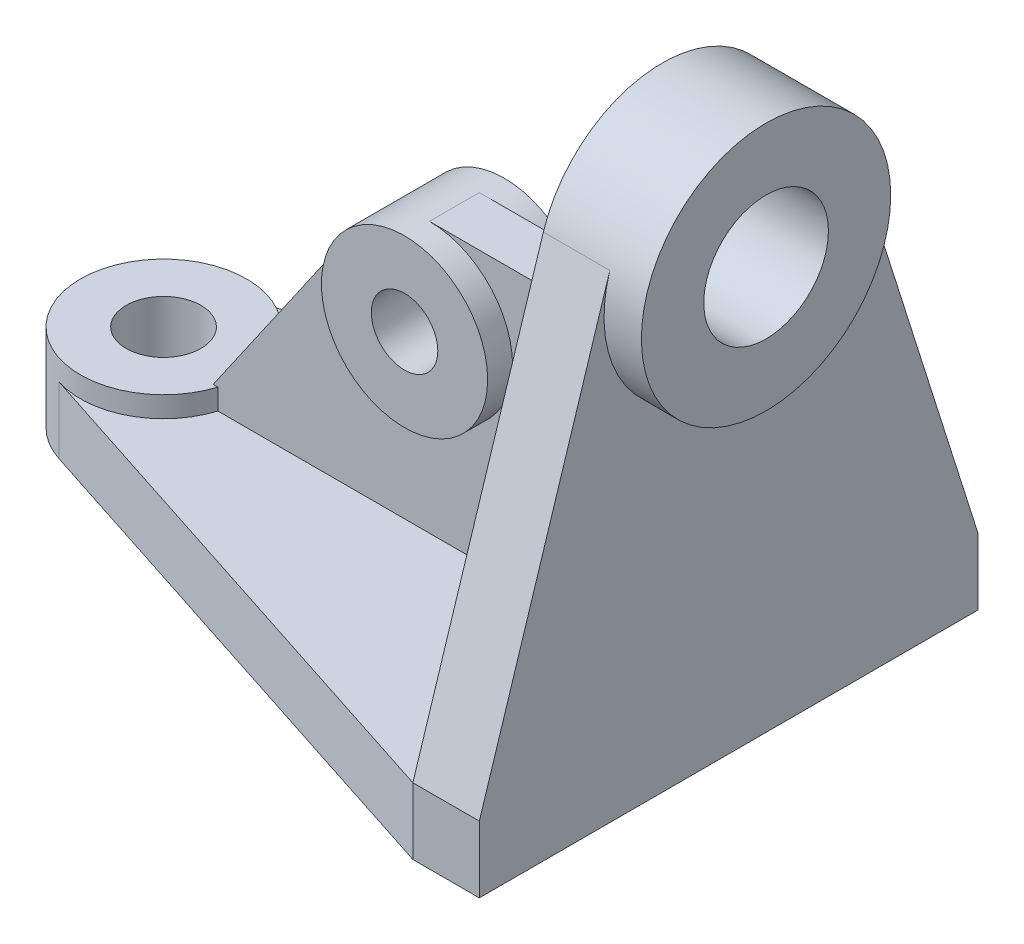
ISO-10303-21;
HEADER;
FILE_DESCRIPTION(('STEP AP214'),'2;1');
FILE_NAME('part.step','',(''),(''),'','','');
FILE_SCHEMA(('AUTOMOTIVE_DESIGN { 1 0 10303 214 1 1 1 1 }'));
ENDSEC;
DATA;
#1=APPLICATION_CONTEXT('core data for automotive mechanical design processes');
#2=APPLICATION_PROTOCOL_DEFINITION('international standard','automotive_design',2000,#1);
#3=PRODUCT_CONTEXT('',#1,'mechanical');
#4=PRODUCT('Part','Part','',(#3));
#5=PRODUCT_RELATED_PRODUCT_CATEGORY('part','',(#4));
#6=PRODUCT_DEFINITION_FORMATION('','',#4);
#7=PRODUCT_DEFINITION_CONTEXT('part definition',#1,'design');
#8=PRODUCT_DEFINITION('design','',#6,#7);
#9=PRODUCT_DEFINITION_SHAPE('','',#8);
#10=(LENGTH_UNIT() NAMED_UNIT(*) SI_UNIT(.MILLI.,.METRE.));
#11=(NAMED_UNIT(*) PLANE_ANGLE_UNIT() SI_UNIT($,.RADIAN.));
#12=(NAMED_UNIT(*) SI_UNIT($,.STERADIAN.) SOLID_ANGLE_UNIT());
#13=UNCERTAINTY_MEASURE_WITH_UNIT(LENGTH_MEASURE(1.E-05),#10,'distance_accuracy_value','');
#14=(GEOMETRIC_REPRESENTATION_CONTEXT(3) GLOBAL_UNCERTAINTY_ASSIGNED_CONTEXT((#13)) GLOBAL_UNIT_ASSIGNED_CONTEXT((#10,
#11,#12)) REPRESENTATION_CONTEXT('',''));
#15=CARTESIAN_POINT('',(0.,0.,0.));
#16=DIRECTION('',(0.,0.,1.));
#17=DIRECTION('',(1.,0.,0.));
#18=AXIS2_PLACEMENT_3D('',#15,#16,#17);
#19=CARTESIAN_POINT('',(0.,16.,0.));
#20=DIRECTION('',(0.,1.,0.));
#21=DIRECTION('',(0.,0.,1.));
#22=AXIS2_PLACEMENT_3D('',#19,#20,#21);
#23=PLANE('',#22);
#24=CARTESIAN_POINT('',(0.,16.,0.));
#25=DIRECTION('',(0.,1.,0.));
#26=DIRECTION('',(0.,0.,1.));
#27=AXIS2_PLACEMENT_3D('',#24,#25,#26);
#28=CIRCLE('',#27,20.);
#29=CARTESIAN_POINT('',(19.0787840283389,16.,-6.));
#30=VERTEX_POINT('',#29);
#31=CARTESIAN_POINT('',(-6.1776661076144,16.,-19.0219988818955));
#32=VERTEX_POINT('',#31);
#33=EDGE_CURVE('E263',#30,#32,#28,.T.);
#34=ORIENTED_EDGE('',*,*,#33,.F.);
#35=DIRECTION('',(-1.,0.,0.));
#36=VECTOR('',#35,1.);
#37=CARTESIAN_POINT('',(0.,16.,-6.));
#38=LINE('',#37,#36);
#39=CARTESIAN_POINT('',(120.,16.,-6.));
#40=VERTEX_POINT('',#39);
#41=EDGE_CURVE('E410',#40,#30,#38,.T.);
#42=ORIENTED_EDGE('',*,*,#41,.F.);
#43=DIRECTION('',(0.,0.,1.));
#44=VECTOR('',#43,1.);
#45=CARTESIAN_POINT('',(120.,16.,0.));
#46=LINE('',#45,#44);
#47=CARTESIAN_POINT('',(120.,16.,-60.));
#48=VERTEX_POINT('',#47);
#49=EDGE_CURVE('E235',#48,#40,#46,.T.);
#50=ORIENTED_EDGE('',*,*,#49,.F.);
#51=DIRECTION('',(-0.951099944094773,0.,0.30888330538072));
#52=VECTOR('',#51,1.);
#53=CARTESIAN_POINT('',(-6.1776661076144,16.,-19.0219988818955));
#54=LINE('',#53,#52);
#55=EDGE_CURVE('E275',#48,#32,#54,.T.);
#56=ORIENTED_EDGE('',*,*,#55,.T.);
#57=EDGE_LOOP('',(#34,#42,#50,#56));
#58=FACE_BOUND('',#57,.T.);
#59=ADVANCED_FACE('F43',(#58),#23,.T.);
#60=DIRECTION('',(-1.,0.,0.));
#61=VECTOR('',#60,1.);
#62=CARTESIAN_POINT('',(0.,16.,6.));
#63=LINE('',#62,#61);
#64=CARTESIAN_POINT('',(120.,16.,6.));
#65=VERTEX_POINT('',#64);
#66=CARTESIAN_POINT('',(19.0787840283389,16.,6.));
#67=VERTEX_POINT('',#66);
#68=EDGE_CURVE('E69',#65,#67,#63,.T.);
#69=ORIENTED_EDGE('',*,*,#68,.T.);
#70=CARTESIAN_POINT('',(-6.1776661076144,16.,19.0219988818955));
#71=VERTEX_POINT('',#70);
#72=EDGE_CURVE('E259',#71,#67,#28,.T.);
#73=ORIENTED_EDGE('',*,*,#72,.F.);
#74=DIRECTION('',(-0.951099944094773,0.,-0.30888330538072));
#75=VECTOR('',#74,1.);
#76=CARTESIAN_POINT('',(-6.1776661076144,16.,19.0219988818954));
#77=LINE('',#76,#75);
#78=CARTESIAN_POINT('',(120.,16.,60.));
#79=VERTEX_POINT('',#78);
#80=EDGE_CURVE('E262',#79,#71,#77,.T.);
#81=ORIENTED_EDGE('',*,*,#80,.F.);
#82=EDGE_CURVE('E233',#65,#79,#46,.T.);
#83=ORIENTED_EDGE('',*,*,#82,.F.);
#84=EDGE_LOOP('',(#69,#73,#81,#83));
#85=FACE_BOUND('',#84,.T.);
#86=ADVANCED_FACE('F338',(#85),#23,.T.);
#87=CARTESIAN_POINT('',(0.,21.,0.));
#88=DIRECTION('',(0.,-1.,0.));
#89=DIRECTION('',(0.,0.,-1.));
#90=AXIS2_PLACEMENT_3D('',#87,#88,#89);
#91=CYLINDRICAL_SURFACE('',#90,20.);
#92=ORIENTED_EDGE('',*,*,#72,.T.);
#93=DIRECTION('',(0.,-1.,0.));
#94=VECTOR('',#93,1.);
#95=CARTESIAN_POINT('',(19.0787840283389,21.,6.));
#96=LINE('',#95,#94);
#97=CARTESIAN_POINT('',(19.0787840283389,21.,6.));
#98=VERTEX_POINT('',#97);
#99=EDGE_CURVE('E210',#67,#98,#96,.F.);
#100=ORIENTED_EDGE('',*,*,#99,.T.);
#101=CARTESIAN_POINT('',(0.,21.,0.));
#102=DIRECTION('',(0.,1.,0.));
#103=DIRECTION('',(0.,0.,1.));
#104=AXIS2_PLACEMENT_3D('',#101,#102,#103);
#105=CIRCLE('',#104,20.);
#106=CARTESIAN_POINT('',(19.0787840283389,21.,-6.));
#107=VERTEX_POINT('',#106);
#108=EDGE_CURVE('E53',#107,#98,#105,.T.);
#109=ORIENTED_EDGE('',*,*,#108,.F.);
#110=DIRECTION('',(0.,-1.,0.));
#111=VECTOR('',#110,1.);
#112=CARTESIAN_POINT('',(19.0787840283389,21.,-6.));
#113=LINE('',#112,#111);
#114=EDGE_CURVE('E61',#30,#107,#113,.F.);
#115=ORIENTED_EDGE('',*,*,#114,.F.);
#116=ORIENTED_EDGE('',*,*,#33,.T.);
#117=DIRECTION('',(0.,-1.,0.));
#118=VECTOR('',#117,1.);
#119=CARTESIAN_POINT('',(-6.1776661076144,16.,-19.0219988818955));
#120=LINE('',#119,#118);
#121=CARTESIAN_POINT('',(-6.1776661076144,0.,-19.0219988818955));
#122=VERTEX_POINT('',#121);
#123=EDGE_CURVE('E279',#32,#122,#120,.T.);
#124=ORIENTED_EDGE('',*,*,#123,.T.);
#125=CARTESIAN_POINT('',(0.,0.,0.));
#126=DIRECTION('',(0.,1.,0.));
#127=DIRECTION('',(0.,0.,1.));
#128=AXIS2_PLACEMENT_3D('',#125,#126,#127);
#129=CIRCLE('',#128,20.);
#130=CARTESIAN_POINT('',(-6.1776661076144,0.,19.0219988818955));
#131=VERTEX_POINT('',#130);
#132=EDGE_CURVE('E318',#122,#131,#129,.T.);
#133=ORIENTED_EDGE('',*,*,#132,.T.);
#134=DIRECTION('',(0.,-1.,0.));
#135=VECTOR('',#134,1.);
#136=CARTESIAN_POINT('',(-6.1776661076144,16.,19.0219988818954));
#137=LINE('',#136,#135);
#138=EDGE_CURVE('E314',#71,#131,#137,.T.);
#139=ORIENTED_EDGE('',*,*,#138,.F.);
#140=EDGE_LOOP('',(#92,#100,#109,#115,#116,#124,#133,#139));
#141=FACE_BOUND('',#140,.T.);
#142=ADVANCED_FACE('F45',(#141),#91,.T.);
#143=CARTESIAN_POINT('',(0.,21.,0.));
#144=DIRECTION('',(0.,-1.,0.));
#145=DIRECTION('',(0.,0.,-1.));
#146=AXIS2_PLACEMENT_3D('',#143,#144,#145);
#147=CYLINDRICAL_SURFACE('',#146,9.);
#148=CARTESIAN_POINT('',(0.,21.,0.));
#149=DIRECTION('',(0.,1.,0.));
#150=DIRECTION('',(0.,0.,1.));
#151=AXIS2_PLACEMENT_3D('',#148,#149,#150);
#152=CIRCLE('',#151,9.);
#153=CARTESIAN_POINT('',(0.,21.,-9.));
#154=VERTEX_POINT('',#153);
#155=EDGE_CURVE('E11',#154,#154,#152,.T.);
#156=CARTESIAN_POINT('',(0.,0.,0.));
#157=DIRECTION('',(0.,1.,0.));
#158=DIRECTION('',(0.,0.,1.));
#159=AXIS2_PLACEMENT_3D('',#156,#157,#158);
#160=CIRCLE('',#159,9.);
#161=CARTESIAN_POINT('',(0.,0.,-9.));
#162=VERTEX_POINT('',#161);
#163=EDGE_CURVE('E47',#162,#162,#160,.T.);
#164=CARTESIAN_POINT('',(0.,21.,-9.));
#165=CARTESIAN_POINT('',(0.,20.78125,-9.));
#166=CARTESIAN_POINT('',(0.,20.5625,-9.));
#167=CARTESIAN_POINT('',(0.,20.125,-9.));
#168=CARTESIAN_POINT('',(0.,19.90625,-9.));
#169=CARTESIAN_POINT('',(0.,19.46875,-9.));
#170=CARTESIAN_POINT('',(0.,19.25,-9.));
#171=CARTESIAN_POINT('',(0.,18.8125,-9.));
#172=CARTESIAN_POINT('',(0.,18.59375,-9.));
#173=CARTESIAN_POINT('',(0.,18.15625,-9.));
#174=CARTESIAN_POINT('',(0.,17.9375,-9.));
#175=CARTESIAN_POINT('',(0.,17.5,-9.));
#176=CARTESIAN_POINT('',(0.,17.28125,-9.));
#177=CARTESIAN_POINT('',(0.,16.84375,-9.));
#178=CARTESIAN_POINT('',(0.,16.625,-9.));
#179=CARTESIAN_POINT('',(0.,16.1875,-9.));
#180=CARTESIAN_POINT('',(0.,15.96875,-9.));
#181=CARTESIAN_POINT('',(0.,15.53125,-9.));
#182=CARTESIAN_POINT('',(0.,15.3125,-9.));
#183=CARTESIAN_POINT('',(0.,14.875,-9.));
#184=CARTESIAN_POINT('',(0.,14.65625,-9.));
#185=CARTESIAN_POINT('',(0.,14.21875,-9.));
#186=CARTESIAN_POINT('',(0.,14.,-9.));
#187=CARTESIAN_POINT('',(0.,13.5625,-9.));
#188=CARTESIAN_POINT('',(0.,13.34375,-9.));
#189=CARTESIAN_POINT('',(0.,12.90625,-9.));
#190=CARTESIAN_POINT('',(0.,12.6875,-9.));
#191=CARTESIAN_POINT('',(0.,12.25,-9.));
#192=CARTESIAN_POINT('',(0.,12.03125,-9.));
#193=CARTESIAN_POINT('',(0.,11.59375,-9.));
#194=CARTESIAN_POINT('',(0.,11.375,-9.));
#195=CARTESIAN_POINT('',(0.,10.9375,-9.));
#196=CARTESIAN_POINT('',(0.,10.71875,-9.));
#197=CARTESIAN_POINT('',(0.,10.28125,-9.));
#198=CARTESIAN_POINT('',(0.,10.0625,-9.));
#199=CARTESIAN_POINT('',(0.,9.625,-9.));
#200=CARTESIAN_POINT('',(0.,9.40625,-9.));
#201=CARTESIAN_POINT('',(0.,8.96875,-9.));
#202=CARTESIAN_POINT('',(0.,8.75,-9.));
#203=CARTESIAN_POINT('',(0.,8.3125,-9.));
#204=CARTESIAN_POINT('',(0.,8.09375,-9.));
#205=CARTESIAN_POINT('',(0.,7.65625,-9.));
#206=CARTESIAN_POINT('',(0.,7.4375,-9.));
#207=CARTESIAN_POINT('',(0.,7.,-9.));
#208=CARTESIAN_POINT('',(0.,6.78125,-9.));
#209=CARTESIAN_POINT('',(0.,6.34375,-9.));
#210=CARTESIAN_POINT('',(0.,6.125,-9.));
#211=CARTESIAN_POINT('',(0.,5.6875,-9.));
#212=CARTESIAN_POINT('',(0.,5.46875,-9.));
#213=CARTESIAN_POINT('',(0.,5.03125,-9.));
#214=CARTESIAN_POINT('',(0.,4.8125,-9.));
#215=CARTESIAN_POINT('',(0.,4.375,-9.));
#216=CARTESIAN_POINT('',(0.,4.15625,-9.));
#217=CARTESIAN_POINT('',(0.,3.71875,-9.));
#218=CARTESIAN_POINT('',(0.,3.5,-9.));
#219=CARTESIAN_POINT('',(0.,3.0625,-9.));
#220=CARTESIAN_POINT('',(0.,2.84375,-9.));
#221=CARTESIAN_POINT('',(0.,2.40625,-9.));
#222=CARTESIAN_POINT('',(0.,2.1875,-9.));
#223=CARTESIAN_POINT('',(0.,1.75,-9.));
#224=CARTESIAN_POINT('',(0.,1.53125,-9.));
#225=CARTESIAN_POINT('',(0.,1.09375,-9.));
#226=CARTESIAN_POINT('',(0.,0.875000000000001,-9.));
#227=CARTESIAN_POINT('',(0.,0.4375,-9.));
#228=CARTESIAN_POINT('',(0.,0.21875,-9.));
#229=CARTESIAN_POINT('',(0.,0.,-9.));
#230=B_SPLINE_CURVE_WITH_KNOTS('',3,(#164,#165,#166,#167,#168,#169,#170,#171,#172,#173,#174,
#175,#176,#177,#178,#179,#180,#181,#182,#183,#184,#185,#186,#187,#188,#189,#190,#191,#192,#193,
#194,#195,#196,#197,#198,#199,#200,#201,#202,#203,#204,#205,#206,#207,#208,#209,#210,#211,#212,
#213,#214,#215,#216,#217,#218,#219,#220,#221,#222,#223,#224,#225,#226,#227,#228,#229),
.UNSPECIFIED.,.F.,.F.,(4,2,2,2,2,2,2,2,2,2,2,2,2,2,2,2,2,2,2,2,2,2,2,2,2,2,2,2,2,2,2,2,4),(0.,
0.656249999999997,1.3125,1.96875,2.625,3.28125,3.9375,4.59375,5.25,5.90625,6.5625,7.21875,7.875,
8.53125,9.1875,9.84375,10.5,11.15625,11.8125,12.46875,13.125,13.78125,14.4375,15.09375,15.75,
16.40625,17.0625,17.71875,18.375,19.03125,19.6875,20.34375,21.),.UNSPECIFIED.);
#231=EDGE_CURVE('BSEAM328',#154,#162,#230,.T.);
#232=ORIENTED_EDGE('',*,*,#155,.T.);
#233=ORIENTED_EDGE('',*,*,#163,.F.);
#234=ORIENTED_EDGE('',*,*,#231,.T.);
#235=ORIENTED_EDGE('',*,*,#231,.F.);
#236=EDGE_LOOP('',(#232,#234,#233,#235));
#237=FACE_BOUND('',#236,.T.);
#238=ADVANCED_FACE('F328',(#237),#147,.F.);
#239=CARTESIAN_POINT('',(0.,21.,0.));
#240=DIRECTION('',(0.,1.,0.));
#241=DIRECTION('',(0.,0.,1.));
#242=AXIS2_PLACEMENT_3D('',#239,#240,#241);
#243=PLANE('',#242);
#244=DIRECTION('',(1.,0.,0.));
#245=VECTOR('',#244,1.);
#246=CARTESIAN_POINT('',(0.,21.,6.));
#247=LINE('',#246,#245);
#248=CARTESIAN_POINT('',(17.9548991179454,21.,6.));
#249=VERTEX_POINT('',#248);
#250=EDGE_CURVE('E206',#249,#98,#247,.T.);
#251=ORIENTED_EDGE('',*,*,#250,.F.);
#252=DIRECTION('',(0.,0.,-1.));
#253=VECTOR('',#252,1.);
#254=CARTESIAN_POINT('',(17.9548991179454,21.,6.));
#255=LINE('',#254,#253);
#256=CARTESIAN_POINT('',(17.9548991179454,21.,-6.));
#257=VERTEX_POINT('',#256);
#258=EDGE_CURVE('E190',#249,#257,#255,.T.);
#259=ORIENTED_EDGE('',*,*,#258,.T.);
#260=DIRECTION('',(1.,0.,0.));
#261=VECTOR('',#260,1.);
#262=CARTESIAN_POINT('',(0.,21.,-6.));
#263=LINE('',#262,#261);
#264=EDGE_CURVE('E201',#257,#107,#263,.T.);
#265=ORIENTED_EDGE('',*,*,#264,.T.);
#266=ORIENTED_EDGE('',*,*,#108,.T.);
#267=EDGE_LOOP('',(#251,#259,#265,#266));
#268=FACE_BOUND('',#267,.T.);
#269=ORIENTED_EDGE('',*,*,#155,.F.);
#270=EDGE_LOOP('',(#269));
#271=FACE_BOUND('',#270,.T.);
#272=ADVANCED_FACE('F330',(#268,#271),#243,.T.);
#273=CARTESIAN_POINT('',(0.,0.,0.));
#274=DIRECTION('',(0.,1.,0.));
#275=DIRECTION('',(0.,0.,1.));
#276=AXIS2_PLACEMENT_3D('',#273,#274,#275);
#277=PLANE('',#276);
#278=ORIENTED_EDGE('',*,*,#132,.F.);
#279=DIRECTION('',(-0.951099944094773,0.,0.30888330538072));
#280=VECTOR('',#279,1.);
#281=CARTESIAN_POINT('',(-6.1776661076144,0.,-19.0219988818955));
#282=LINE('',#281,#280);
#283=CARTESIAN_POINT('',(120.,0.,-60.));
#284=VERTEX_POINT('',#283);
#285=EDGE_CURVE('E292',#284,#122,#282,.T.);
#286=ORIENTED_EDGE('',*,*,#285,.F.);
#287=DIRECTION('',(-1.,0.,0.));
#288=VECTOR('',#287,1.);
#289=CARTESIAN_POINT('',(0.,0.,-60.));
#290=LINE('',#289,#288);
#291=CARTESIAN_POINT('',(136.,0.,-60.));
#292=VERTEX_POINT('',#291);
#293=EDGE_CURVE('E289',#292,#284,#290,.T.);
#294=ORIENTED_EDGE('',*,*,#293,.F.);
#295=DIRECTION('',(0.,0.,-1.));
#296=VECTOR('',#295,1.);
#297=CARTESIAN_POINT('',(136.,0.,0.));
#298=LINE('',#297,#296);
#299=CARTESIAN_POINT('',(136.,0.,60.));
#300=VERTEX_POINT('',#299);
#301=EDGE_CURVE('E286',#300,#292,#298,.T.);
#302=ORIENTED_EDGE('',*,*,#301,.F.);
#303=DIRECTION('',(1.,0.,0.));
#304=VECTOR('',#303,1.);
#305=CARTESIAN_POINT('',(0.,0.,60.));
#306=LINE('',#305,#304);
#307=CARTESIAN_POINT('',(120.,0.,60.));
#308=VERTEX_POINT('',#307);
#309=EDGE_CURVE('E283',#308,#300,#306,.T.);
#310=ORIENTED_EDGE('',*,*,#309,.F.);
#311=DIRECTION('',(-0.951099944094773,0.,-0.30888330538072));
#312=VECTOR('',#311,1.);
#313=CARTESIAN_POINT('',(-6.1776661076144,0.,19.0219988818954));
#314=LINE('',#313,#312);
#315=EDGE_CURVE('E256',#308,#131,#314,.T.);
#316=ORIENTED_EDGE('',*,*,#315,.T.);
#317=EDGE_LOOP('',(#278,#286,#294,#302,#310,#316));
#318=FACE_BOUND('',#317,.T.);
#319=ORIENTED_EDGE('',*,*,#163,.T.);
#320=EDGE_LOOP('',(#319));
#321=FACE_BOUND('',#320,.T.);
#322=ADVANCED_FACE('F326',(#318,#321),#277,.F.);
#323=CARTESIAN_POINT('',(-6.1776661076144,16.,19.0219988818954));
#324=DIRECTION('',(-0.30888330538072,0.,0.951099944094773));
#325=DIRECTION('',(0.951099944094773,0.,0.30888330538072));
#326=AXIS2_PLACEMENT_3D('',#323,#324,#325);
#327=PLANE('',#326);
#328=ORIENTED_EDGE('',*,*,#315,.F.);
#329=DIRECTION('',(0.,-1.,0.));
#330=VECTOR('',#329,1.);
#331=CARTESIAN_POINT('',(120.,16.,60.));
#332=LINE('',#331,#330);
#333=EDGE_CURVE('E311',#79,#308,#332,.T.);
#334=ORIENTED_EDGE('',*,*,#333,.F.);
#335=ORIENTED_EDGE('',*,*,#80,.T.);
#336=ORIENTED_EDGE('',*,*,#138,.T.);
#337=EDGE_LOOP('',(#328,#334,#335,#336));
#338=FACE_BOUND('',#337,.T.);
#339=ADVANCED_FACE('F366',(#338),#327,.T.);
#340=CARTESIAN_POINT('',(0.,16.,60.));
#341=DIRECTION('',(0.,0.,-1.));
#342=DIRECTION('',(-1.,0.,0.));
#343=AXIS2_PLACEMENT_3D('',#340,#341,#342);
#344=PLANE('',#343);
#345=ORIENTED_EDGE('',*,*,#309,.T.);
#346=DIRECTION('',(0.,-1.,0.));
#347=VECTOR('',#346,1.);
#348=CARTESIAN_POINT('',(136.,16.,60.));
#349=LINE('',#348,#347);
#350=CARTESIAN_POINT('',(136.,16.,60.));
#351=VERTEX_POINT('',#350);
#352=EDGE_CURVE('E307',#351,#300,#349,.T.);
#353=ORIENTED_EDGE('',*,*,#352,.F.);
#354=DIRECTION('',(1.,0.,0.));
#355=VECTOR('',#354,1.);
#356=CARTESIAN_POINT('',(0.,16.,60.));
#357=LINE('',#356,#355);
#358=EDGE_CURVE('E267',#79,#351,#357,.T.);
#359=ORIENTED_EDGE('',*,*,#358,.F.);
#360=ORIENTED_EDGE('',*,*,#333,.T.);
#361=EDGE_LOOP('',(#345,#353,#359,#360));
#362=FACE_BOUND('',#361,.T.);
#363=ADVANCED_FACE('F362',(#362),#344,.F.);
#364=CARTESIAN_POINT('',(136.,16.,0.));
#365=DIRECTION('',(-1.,0.,0.));
#366=DIRECTION('',(0.,0.,1.));
#367=AXIS2_PLACEMENT_3D('',#364,#365,#366);
#368=PLANE('',#367);
#369=ORIENTED_EDGE('',*,*,#301,.T.);
#370=DIRECTION('',(0.,-1.,0.));
#371=VECTOR('',#370,1.);
#372=CARTESIAN_POINT('',(136.,16.,-60.));
#373=LINE('',#372,#371);
#374=CARTESIAN_POINT('',(136.,16.,-60.));
#375=VERTEX_POINT('',#374);
#376=EDGE_CURVE('E303',#375,#292,#373,.T.);
#377=ORIENTED_EDGE('',*,*,#376,.F.);
#378=DIRECTION('',(0.,0.953254218877943,0.302169479251962));
#379=VECTOR('',#378,1.);
#380=CARTESIAN_POINT('',(136.,18.7435621618475,-59.1303256431252));
#381=LINE('',#380,#379);
#382=CARTESIAN_POINT('',(136.,115.065084377559,-28.5976265663383));
#383=VERTEX_POINT('',#382);
#384=EDGE_CURVE('E234',#375,#383,#381,.T.);
#385=ORIENTED_EDGE('',*,*,#384,.T.);
#386=CARTESIAN_POINT('',(136.,106.,0.));
#387=DIRECTION('',(1.,0.,0.));
#388=DIRECTION('',(0.,0.,-1.));
#389=AXIS2_PLACEMENT_3D('',#386,#387,#388);
#390=CIRCLE('',#389,30.);
#391=CARTESIAN_POINT('',(136.,115.065084377559,28.5976265663383));
#392=VERTEX_POINT('',#391);
#393=EDGE_CURVE('E223',#392,#383,#390,.T.);
#394=ORIENTED_EDGE('',*,*,#393,.F.);
#395=DIRECTION('',(0.,0.953254218877944,-0.302169479251962));
#396=VECTOR('',#395,1.);
#397=CARTESIAN_POINT('',(136.,18.7435621618475,59.1303256431252));
#398=LINE('',#397,#396);
#399=EDGE_CURVE('E245',#351,#392,#398,.T.);
#400=ORIENTED_EDGE('',*,*,#399,.F.);
#401=ORIENTED_EDGE('',*,*,#352,.T.);
#402=EDGE_LOOP('',(#369,#377,#385,#394,#400,#401));
#403=FACE_BOUND('',#402,.T.);
#404=ADVANCED_FACE('F358',(#403),#368,.F.);
#405=CARTESIAN_POINT('',(0.,16.,-60.));
#406=DIRECTION('',(0.,0.,1.));
#407=DIRECTION('',(1.,0.,0.));
#408=AXIS2_PLACEMENT_3D('',#405,#406,#407);
#409=PLANE('',#408);
#410=ORIENTED_EDGE('',*,*,#293,.T.);
#411=DIRECTION('',(0.,-1.,0.));
#412=VECTOR('',#411,1.);
#413=CARTESIAN_POINT('',(120.,16.,-60.));
#414=LINE('',#413,#412);
#415=EDGE_CURVE('E299',#48,#284,#414,.T.);
#416=ORIENTED_EDGE('',*,*,#415,.F.);
#417=DIRECTION('',(-1.,0.,0.));
#418=VECTOR('',#417,1.);
#419=CARTESIAN_POINT('',(0.,16.,-60.));
#420=LINE('',#419,#418);
#421=EDGE_CURVE('E271',#375,#48,#420,.T.);
#422=ORIENTED_EDGE('',*,*,#421,.F.);
#423=ORIENTED_EDGE('',*,*,#376,.T.);
#424=EDGE_LOOP('',(#410,#416,#422,#423));
#425=FACE_BOUND('',#424,.T.);
#426=ADVANCED_FACE('F354',(#425),#409,.F.);
#427=CARTESIAN_POINT('',(-6.1776661076144,16.,-19.0219988818955));
#428=DIRECTION('',(0.30888330538072,0.,0.951099944094773));
#429=DIRECTION('',(0.951099944094773,0.,-0.30888330538072));
#430=AXIS2_PLACEMENT_3D('',#427,#428,#429);
#431=PLANE('',#430);
#432=ORIENTED_EDGE('',*,*,#285,.T.);
#433=ORIENTED_EDGE('',*,*,#123,.F.);
#434=ORIENTED_EDGE('',*,*,#55,.F.);
#435=ORIENTED_EDGE('',*,*,#415,.T.);
#436=EDGE_LOOP('',(#432,#433,#434,#435));
#437=FACE_BOUND('',#436,.T.);
#438=ADVANCED_FACE('F350',(#437),#431,.F.);
#439=CARTESIAN_POINT('',(120.,18.7435621618475,-59.1303256431252));
#440=DIRECTION('',(0.,0.302169479251962,-0.953254218877943));
#441=DIRECTION('',(0.,0.953254218877943,0.302169479251962));
#442=AXIS2_PLACEMENT_3D('',#439,#440,#441);
#443=PLANE('',#442);
#444=ORIENTED_EDGE('',*,*,#384,.F.);
#445=ORIENTED_EDGE('',*,*,#421,.T.);
#446=DIRECTION('',(0.,0.953254218877943,0.302169479251962));
#447=VECTOR('',#446,1.);
#448=CARTESIAN_POINT('',(120.,18.7435621618475,-59.1303256431252));
#449=LINE('',#448,#447);
#450=CARTESIAN_POINT('',(120.,115.065084377559,-28.5976265663383));
#451=VERTEX_POINT('',#450);
#452=EDGE_CURVE('E238',#48,#451,#449,.T.);
#453=ORIENTED_EDGE('',*,*,#452,.T.);
#454=DIRECTION('',(1.,0.,0.));
#455=VECTOR('',#454,1.);
#456=CARTESIAN_POINT('',(120.,115.065084377559,-28.5976265663383));
#457=LINE('',#456,#455);
#458=EDGE_CURVE('E252',#451,#383,#457,.T.);
#459=ORIENTED_EDGE('',*,*,#458,.T.);
#460=EDGE_LOOP('',(#444,#445,#453,#459));
#461=FACE_BOUND('',#460,.T.);
#462=ADVANCED_FACE('F353',(#461),#443,.T.);
#463=CARTESIAN_POINT('',(120.,18.7435621618475,59.1303256431252));
#464=DIRECTION('',(0.,-0.302169479251962,-0.953254218877943));
#465=DIRECTION('',(0.,0.953254218877944,-0.302169479251962));
#466=AXIS2_PLACEMENT_3D('',#463,#464,#465);
#467=PLANE('',#466);
#468=ORIENTED_EDGE('',*,*,#399,.T.);
#469=DIRECTION('',(1.,0.,0.));
#470=VECTOR('',#469,1.);
#471=CARTESIAN_POINT('',(120.,115.065084377559,28.5976265663383));
#472=LINE('',#471,#470);
#473=CARTESIAN_POINT('',(120.,115.065084377559,28.5976265663383));
#474=VERTEX_POINT('',#473);
#475=EDGE_CURVE('E242',#474,#392,#472,.T.);
#476=ORIENTED_EDGE('',*,*,#475,.F.);
#477=DIRECTION('',(0.,0.953254218877944,-0.302169479251962));
#478=VECTOR('',#477,1.);
#479=CARTESIAN_POINT('',(120.,18.7435621618475,59.1303256431252));
#480=LINE('',#479,#478);
#481=EDGE_CURVE('E229',#79,#474,#480,.T.);
#482=ORIENTED_EDGE('',*,*,#481,.F.);
#483=ORIENTED_EDGE('',*,*,#358,.T.);
#484=EDGE_LOOP('',(#468,#476,#482,#483));
#485=FACE_BOUND('',#484,.T.);
#486=ADVANCED_FACE('F348',(#485),#467,.F.);
#487=CARTESIAN_POINT('',(120.,0.,0.));
#488=DIRECTION('',(1.,0.,0.));
#489=DIRECTION('',(0.,0.,-1.));
#490=AXIS2_PLACEMENT_3D('',#487,#488,#489);
#491=PLANE('',#490);
#492=DIRECTION('',(0.,0.,-1.));
#493=VECTOR('',#492,1.);
#494=CARTESIAN_POINT('',(120.,81.,6.));
#495=LINE('',#494,#493);
#496=CARTESIAN_POINT('',(120.,81.,6.));
#497=VERTEX_POINT('',#496);
#498=CARTESIAN_POINT('',(120.,81.,-6.));
#499=VERTEX_POINT('',#498);
#500=EDGE_CURVE('E163',#497,#499,#495,.T.);
#501=ORIENTED_EDGE('',*,*,#500,.F.);
#502=DIRECTION('',(0.,-1.,0.));
#503=VECTOR('',#502,1.);
#504=CARTESIAN_POINT('',(120.,0.,6.));
#505=LINE('',#504,#503);
#506=EDGE_CURVE('E192',#497,#65,#505,.T.);
#507=ORIENTED_EDGE('',*,*,#506,.T.);
#508=ORIENTED_EDGE('',*,*,#82,.T.);
#509=ORIENTED_EDGE('',*,*,#481,.T.);
#510=CARTESIAN_POINT('',(120.,106.,0.));
#511=DIRECTION('',(1.,0.,0.));
#512=DIRECTION('',(0.,0.,-1.));
#513=AXIS2_PLACEMENT_3D('',#510,#511,#512);
#514=CIRCLE('',#513,30.);
#515=EDGE_CURVE('E219',#451,#474,#514,.T.);
#516=ORIENTED_EDGE('',*,*,#515,.F.);
#517=ORIENTED_EDGE('',*,*,#452,.F.);
#518=ORIENTED_EDGE('',*,*,#49,.T.);
#519=DIRECTION('',(0.,-1.,0.));
#520=VECTOR('',#519,1.);
#521=CARTESIAN_POINT('',(120.,0.,-6.));
#522=LINE('',#521,#520);
#523=EDGE_CURVE('E168',#499,#40,#522,.T.);
#524=ORIENTED_EDGE('',*,*,#523,.F.);
#525=EDGE_LOOP('',(#501,#507,#508,#509,#516,#517,#518,#524));
#526=FACE_BOUND('',#525,.T.);
#527=CARTESIAN_POINT('',(120.,106.,0.));
#528=DIRECTION('',(1.,0.,0.));
#529=DIRECTION('',(0.,0.,-1.));
#530=AXIS2_PLACEMENT_3D('',#527,#528,#529);
#531=CIRCLE('',#530,15.);
#532=CARTESIAN_POINT('',(120.,106.,-15.));
#533=VERTEX_POINT('',#532);
#534=EDGE_CURVE('E213',#533,#533,#531,.T.);
#535=ORIENTED_EDGE('',*,*,#534,.T.);
#536=EDGE_LOOP('',(#535));
#537=FACE_BOUND('',#536,.T.);
#538=ADVANCED_FACE('F392',(#526,#537),#491,.F.);
#539=CARTESIAN_POINT('',(145.,106.,0.));
#540=DIRECTION('',(-1.,0.,0.));
#541=DIRECTION('',(0.,0.,1.));
#542=AXIS2_PLACEMENT_3D('',#539,#540,#541);
#543=CYLINDRICAL_SURFACE('',#542,15.);
#544=CARTESIAN_POINT('',(145.,106.,0.));
#545=DIRECTION('',(1.,0.,0.));
#546=DIRECTION('',(0.,0.,-1.));
#547=AXIS2_PLACEMENT_3D('',#544,#545,#546);
#548=CIRCLE('',#547,15.);
#549=CARTESIAN_POINT('',(145.,106.,-15.));
#550=VERTEX_POINT('',#549);
#551=EDGE_CURVE('E214',#550,#550,#548,.T.);
#552=ORIENTED_EDGE('',*,*,#551,.T.);
#553=EDGE_LOOP('',(#552));
#554=FACE_BOUND('',#553,.T.);
#555=ORIENTED_EDGE('',*,*,#534,.F.);
#556=EDGE_LOOP('',(#555));
#557=FACE_BOUND('',#556,.T.);
#558=ADVANCED_FACE('F423',(#554,#557),#543,.F.);
#559=CARTESIAN_POINT('',(145.,106.,0.));
#560=DIRECTION('',(-1.,0.,0.));
#561=DIRECTION('',(0.,0.,1.));
#562=AXIS2_PLACEMENT_3D('',#559,#560,#561);
#563=CYLINDRICAL_SURFACE('',#562,30.);
#564=ORIENTED_EDGE('',*,*,#458,.F.);
#565=ORIENTED_EDGE('',*,*,#515,.T.);
#566=ORIENTED_EDGE('',*,*,#475,.T.);
#567=ORIENTED_EDGE('',*,*,#393,.T.);
#568=EDGE_LOOP('',(#564,#565,#566,#567));
#569=FACE_BOUND('',#568,.T.);
#570=CARTESIAN_POINT('',(145.,106.,0.));
#571=DIRECTION('',(1.,0.,0.));
#572=DIRECTION('',(0.,0.,-1.));
#573=AXIS2_PLACEMENT_3D('',#570,#571,#572);
#574=CIRCLE('',#573,30.);
#575=CARTESIAN_POINT('',(145.,106.,-30.));
#576=VERTEX_POINT('',#575);
#577=EDGE_CURVE('E218',#576,#576,#574,.T.);
#578=ORIENTED_EDGE('',*,*,#577,.F.);
#579=EDGE_LOOP('',(#578));
#580=FACE_BOUND('',#579,.T.);
#581=ADVANCED_FACE('F419',(#569,#580),#563,.T.);
#582=CARTESIAN_POINT('',(145.,0.,0.));
#583=DIRECTION('',(1.,0.,0.));
#584=DIRECTION('',(0.,0.,-1.));
#585=AXIS2_PLACEMENT_3D('',#582,#583,#584);
#586=PLANE('',#585);
#587=ORIENTED_EDGE('',*,*,#551,.F.);
#588=EDGE_LOOP('',(#587));
#589=FACE_BOUND('',#588,.T.);
#590=ORIENTED_EDGE('',*,*,#577,.T.);
#591=EDGE_LOOP('',(#590));
#592=FACE_BOUND('',#591,.T.);
#593=ADVANCED_FACE('F422',(#589,#592),#586,.T.);
#594=CARTESIAN_POINT('',(0.,0.,6.));
#595=DIRECTION('',(0.,0.,1.));
#596=DIRECTION('',(1.,0.,0.));
#597=AXIS2_PLACEMENT_3D('',#594,#595,#596);
#598=PLANE('',#597);
#599=ORIENTED_EDGE('',*,*,#99,.F.);
#600=ORIENTED_EDGE('',*,*,#68,.F.);
#601=ORIENTED_EDGE('',*,*,#506,.F.);
#602=DIRECTION('',(1.,0.,0.));
#603=VECTOR('',#602,1.);
#604=CARTESIAN_POINT('',(0.,81.,6.));
#605=LINE('',#604,#603);
#606=CARTESIAN_POINT('',(70.,81.,6.));
#607=VERTEX_POINT('',#606);
#608=EDGE_CURVE('E186',#607,#497,#605,.T.);
#609=ORIENTED_EDGE('',*,*,#608,.F.);
#610=CARTESIAN_POINT('',(70.,61.,6.));
#611=DIRECTION('',(0.,0.,1.));
#612=DIRECTION('',(1.,0.,0.));
#613=AXIS2_PLACEMENT_3D('',#610,#611,#612);
#614=CIRCLE('',#613,20.);
#615=CARTESIAN_POINT('',(53.560286641323,72.3901635056102,6.));
#616=VERTEX_POINT('',#615);
#617=EDGE_CURVE('E167',#616,#607,#614,.T.);
#618=ORIENTED_EDGE('',*,*,#617,.F.);
#619=DIRECTION('',(0.569508175280511,0.821985667933854,0.));
#620=VECTOR('',#619,1.);
#621=CARTESIAN_POINT('',(2.3007362925732,-1.5940522796201,6.));
#622=LINE('',#621,#620);
#623=EDGE_CURVE('E404',#249,#616,#622,.T.);
#624=ORIENTED_EDGE('',*,*,#623,.F.);
#625=ORIENTED_EDGE('',*,*,#250,.T.);
#626=EDGE_LOOP('',(#599,#600,#601,#609,#618,#624,#625));
#627=FACE_BOUND('',#626,.T.);
#628=ADVANCED_FACE('F401',(#627),#598,.T.);
#629=CARTESIAN_POINT('',(0.,0.,-6.));
#630=DIRECTION('',(0.,0.,1.));
#631=DIRECTION('',(1.,0.,0.));
#632=AXIS2_PLACEMENT_3D('',#629,#630,#631);
#633=PLANE('',#632);
#634=ORIENTED_EDGE('',*,*,#41,.T.);
#635=ORIENTED_EDGE('',*,*,#114,.T.);
#636=ORIENTED_EDGE('',*,*,#264,.F.);
#637=DIRECTION('',(0.569508175280511,0.821985667933854,0.));
#638=VECTOR('',#637,1.);
#639=CARTESIAN_POINT('',(2.3007362925732,-1.5940522796201,-6.));
#640=LINE('',#639,#638);
#641=CARTESIAN_POINT('',(53.560286641323,72.3901635056102,-6.));
#642=VERTEX_POINT('',#641);
#643=EDGE_CURVE('E177',#257,#642,#640,.T.);
#644=ORIENTED_EDGE('',*,*,#643,.T.);
#645=CARTESIAN_POINT('',(70.,61.,-6.));
#646=DIRECTION('',(0.,0.,1.));
#647=DIRECTION('',(1.,0.,0.));
#648=AXIS2_PLACEMENT_3D('',#645,#646,#647);
#649=CIRCLE('',#648,20.);
#650=CARTESIAN_POINT('',(70.,81.,-6.));
#651=VERTEX_POINT('',#650);
#652=EDGE_CURVE('E172',#642,#651,#649,.T.);
#653=ORIENTED_EDGE('',*,*,#652,.T.);
#654=DIRECTION('',(1.,0.,0.));
#655=VECTOR('',#654,1.);
#656=CARTESIAN_POINT('',(0.,81.,-6.));
#657=LINE('',#656,#655);
#658=EDGE_CURVE('E156',#651,#499,#657,.T.);
#659=ORIENTED_EDGE('',*,*,#658,.T.);
#660=ORIENTED_EDGE('',*,*,#523,.T.);
#661=EDGE_LOOP('',(#634,#635,#636,#644,#653,#659,#660));
#662=FACE_BOUND('',#661,.T.);
#663=ADVANCED_FACE('F174',(#662),#633,.F.);
#664=CARTESIAN_POINT('',(2.3007362925732,-1.5940522796201,6.));
#665=DIRECTION('',(-0.821985667933853,0.569508175280511,0.));
#666=DIRECTION('',(-0.569508175280511,-0.821985667933854,0.));
#667=AXIS2_PLACEMENT_3D('',#664,#665,#666);
#668=PLANE('',#667);
#669=ORIENTED_EDGE('',*,*,#643,.F.);
#670=ORIENTED_EDGE('',*,*,#258,.F.);
#671=ORIENTED_EDGE('',*,*,#623,.T.);
#672=DIRECTION('',(0.,0.,-1.));
#673=VECTOR('',#672,1.);
#674=CARTESIAN_POINT('',(53.560286641323,72.3901635056102,6.));
#675=LINE('',#674,#673);
#676=EDGE_CURVE('E198',#616,#642,#675,.T.);
#677=ORIENTED_EDGE('',*,*,#676,.T.);
#678=EDGE_LOOP('',(#669,#670,#671,#677));
#679=FACE_BOUND('',#678,.T.);
#680=ADVANCED_FACE('F408',(#679),#668,.T.);
#681=CARTESIAN_POINT('',(0.,81.,6.));
#682=DIRECTION('',(0.,1.,0.));
#683=DIRECTION('',(-1.,0.,0.));
#684=AXIS2_PLACEMENT_3D('',#681,#682,#683);
#685=PLANE('',#684);
#686=ORIENTED_EDGE('',*,*,#658,.F.);
#687=DIRECTION('',(0.,0.,-1.));
#688=VECTOR('',#687,1.);
#689=CARTESIAN_POINT('',(70.,81.,6.));
#690=LINE('',#689,#688);
#691=EDGE_CURVE('E161',#607,#651,#690,.T.);
#692=ORIENTED_EDGE('',*,*,#691,.F.);
#693=ORIENTED_EDGE('',*,*,#608,.T.);
#694=ORIENTED_EDGE('',*,*,#500,.T.);
#695=EDGE_LOOP('',(#686,#692,#693,#694));
#696=FACE_BOUND('',#695,.T.);
#697=ADVANCED_FACE('F158',(#696),#685,.T.);
#698=CARTESIAN_POINT('',(70.,61.,12.));
#699=DIRECTION('',(0.,0.,-1.));
#700=DIRECTION('',(-1.,0.,0.));
#701=AXIS2_PLACEMENT_3D('',#698,#699,#700);
#702=CYLINDRICAL_SURFACE('',#701,20.);
#703=CARTESIAN_POINT('',(70.,61.,12.));
#704=DIRECTION('',(0.,0.,1.));
#705=DIRECTION('',(1.,0.,0.));
#706=AXIS2_PLACEMENT_3D('',#703,#704,#705);
#707=CIRCLE('',#706,20.);
#708=CARTESIAN_POINT('',(90.,61.,12.));
#709=VERTEX_POINT('',#708);
#710=EDGE_CURVE('E181',#709,#709,#707,.T.);
#711=ORIENTED_EDGE('',*,*,#710,.F.);
#712=EDGE_LOOP('',(#711));
#713=FACE_BOUND('',#712,.T.);
#714=CARTESIAN_POINT('',(70.,61.,-12.));
#715=DIRECTION('',(0.,0.,1.));
#716=DIRECTION('',(1.,0.,0.));
#717=AXIS2_PLACEMENT_3D('',#714,#715,#716);
#718=CIRCLE('',#717,20.);
#719=CARTESIAN_POINT('',(90.,61.,-12.));
#720=VERTEX_POINT('',#719);
#721=EDGE_CURVE('E638',#720,#720,#718,.T.);
#722=ORIENTED_EDGE('',*,*,#721,.T.);
#723=EDGE_LOOP('',(#722));
#724=FACE_BOUND('',#723,.T.);
#725=ORIENTED_EDGE('',*,*,#652,.F.);
#726=ORIENTED_EDGE('',*,*,#676,.F.);
#727=ORIENTED_EDGE('',*,*,#617,.T.);
#728=ORIENTED_EDGE('',*,*,#691,.T.);
#729=EDGE_LOOP('',(#725,#726,#727,#728));
#730=FACE_BOUND('',#729,.T.);
#731=ADVANCED_FACE('F184',(#713,#724,#730),#702,.T.);
#732=CARTESIAN_POINT('',(70.,61.,12.));
#733=DIRECTION('',(0.,0.,-1.));
#734=DIRECTION('',(-1.,0.,0.));
#735=AXIS2_PLACEMENT_3D('',#732,#733,#734);
#736=CYLINDRICAL_SURFACE('',#735,7.99999999999999);
#737=CARTESIAN_POINT('',(70.,61.,12.));
#738=DIRECTION('',(0.,0.,1.));
#739=DIRECTION('',(1.,0.,0.));
#740=AXIS2_PLACEMENT_3D('',#737,#738,#739);
#741=CIRCLE('',#740,7.99999999999999);
#742=CARTESIAN_POINT('',(78.,61.,12.));
#743=VERTEX_POINT('',#742);
#744=EDGE_CURVE('E641',#743,#743,#741,.T.);
#745=ORIENTED_EDGE('',*,*,#744,.T.);
#746=EDGE_LOOP('',(#745));
#747=FACE_BOUND('',#746,.T.);
#748=CARTESIAN_POINT('',(70.,61.,-12.));
#749=DIRECTION('',(0.,0.,1.));
#750=DIRECTION('',(1.,0.,0.));
#751=AXIS2_PLACEMENT_3D('',#748,#749,#750);
#752=CIRCLE('',#751,7.99999999999999);
#753=CARTESIAN_POINT('',(78.,61.,-12.));
#754=VERTEX_POINT('',#753);
#755=EDGE_CURVE('E635',#754,#754,#752,.T.);
#756=ORIENTED_EDGE('',*,*,#755,.F.);
#757=EDGE_LOOP('',(#756));
#758=FACE_BOUND('',#757,.T.);
#759=ADVANCED_FACE('F572',(#747,#758),#736,.F.);
#760=CARTESIAN_POINT('',(0.,0.,12.));
#761=DIRECTION('',(0.,0.,1.));
#762=DIRECTION('',(1.,0.,0.));
#763=AXIS2_PLACEMENT_3D('',#760,#761,#762);
#764=PLANE('',#763);
#765=ORIENTED_EDGE('',*,*,#744,.F.);
#766=EDGE_LOOP('',(#765));
#767=FACE_BOUND('',#766,.T.);
#768=ORIENTED_EDGE('',*,*,#710,.T.);
#769=EDGE_LOOP('',(#768));
#770=FACE_BOUND('',#769,.T.);
#771=ADVANCED_FACE('F582',(#767,#770),#764,.T.);
#772=CARTESIAN_POINT('',(0.,0.,-12.));
#773=DIRECTION('',(0.,0.,1.));
#774=DIRECTION('',(1.,0.,0.));
#775=AXIS2_PLACEMENT_3D('',#772,#773,#774);
#776=PLANE('',#775);
#777=ORIENTED_EDGE('',*,*,#755,.T.);
#778=EDGE_LOOP('',(#777));
#779=FACE_BOUND('',#778,.T.);
#780=ORIENTED_EDGE('',*,*,#721,.F.);
#781=EDGE_LOOP('',(#780));
#782=FACE_BOUND('',#781,.T.);
#783=ADVANCED_FACE('F591',(#779,#782),#776,.F.);
#784=CLOSED_SHELL('',(#59,#86,#142,#238,#272,#322,#339,#363,#404,#426,#438,#462,#486,#538,#558,
#581,#593,#628,#663,#680,#697,#731,#759,#771,#783));
#785=MANIFOLD_SOLID_BREP('B2',#784);
#786=ADVANCED_BREP_SHAPE_REPRESENTATION('',(#18,#785),#14);
#787=SHAPE_DEFINITION_REPRESENTATION(#9,#786);
ENDSEC;
END-ISO-10303-21;
